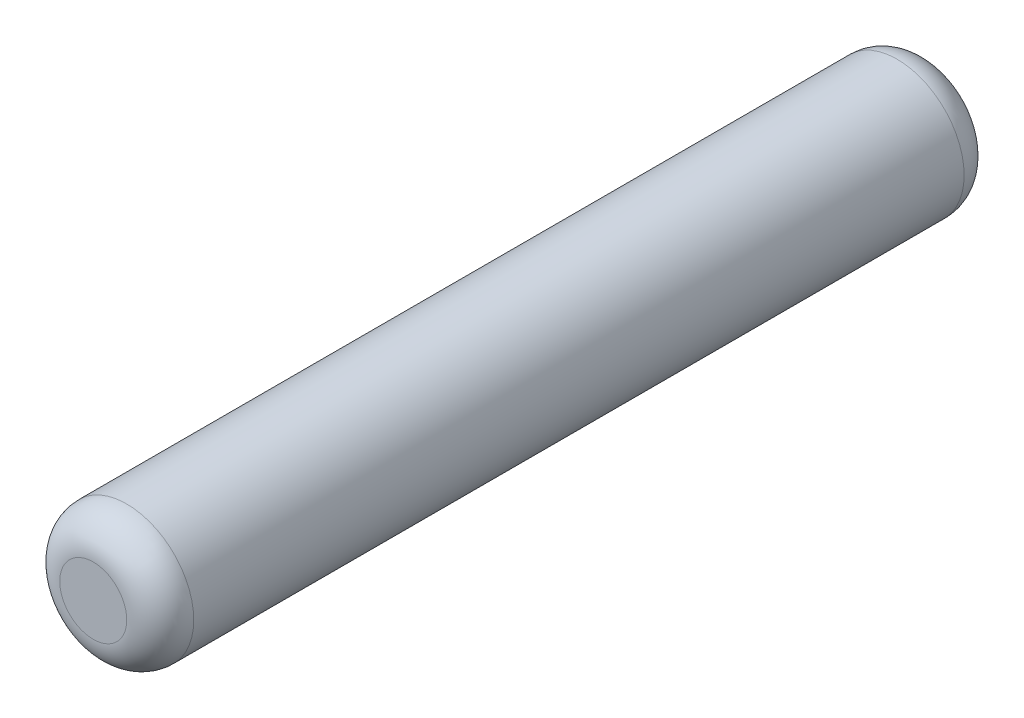
ISO-10303-21;
HEADER;
FILE_DESCRIPTION(('STEP AP214'),'2;1');
FILE_NAME('part.step','',(''),(''),'','','');
FILE_SCHEMA(('AUTOMOTIVE_DESIGN { 1 0 10303 214 1 1 1 1 }'));
ENDSEC;
DATA;
#1=APPLICATION_CONTEXT('core data for automotive mechanical design processes');
#2=APPLICATION_PROTOCOL_DEFINITION('international standard','automotive_design',2000,#1);
#3=PRODUCT_CONTEXT('',#1,'mechanical');
#4=PRODUCT('Part','Part','',(#3));
#5=PRODUCT_RELATED_PRODUCT_CATEGORY('part','',(#4));
#6=PRODUCT_DEFINITION_FORMATION('','',#4);
#7=PRODUCT_DEFINITION_CONTEXT('part definition',#1,'design');
#8=PRODUCT_DEFINITION('design','',#6,#7);
#9=PRODUCT_DEFINITION_SHAPE('','',#8);
#10=(LENGTH_UNIT() NAMED_UNIT(*) SI_UNIT(.MILLI.,.METRE.));
#11=(NAMED_UNIT(*) PLANE_ANGLE_UNIT() SI_UNIT($,.RADIAN.));
#12=(NAMED_UNIT(*) SI_UNIT($,.STERADIAN.) SOLID_ANGLE_UNIT());
#13=UNCERTAINTY_MEASURE_WITH_UNIT(LENGTH_MEASURE(1.E-05),#10,'distance_accuracy_value','');
#14=(GEOMETRIC_REPRESENTATION_CONTEXT(3) GLOBAL_UNCERTAINTY_ASSIGNED_CONTEXT((#13)) GLOBAL_UNIT_ASSIGNED_CONTEXT((#10,
#11,#12)) REPRESENTATION_CONTEXT('',''));
#15=CARTESIAN_POINT('',(0.,0.,0.));
#16=DIRECTION('',(0.,0.,1.));
#17=DIRECTION('',(1.,0.,0.));
#18=AXIS2_PLACEMENT_3D('',#15,#16,#17);
#19=CARTESIAN_POINT('',(0.,0.,250.));
#20=DIRECTION('',(0.,0.,-1.));
#21=DIRECTION('',(-1.,0.,0.));
#22=AXIS2_PLACEMENT_3D('',#19,#20,#21);
#23=CYLINDRICAL_SURFACE('',#22,20.);
#24=CARTESIAN_POINT('',(0.,0.,10.));
#25=DIRECTION('',(0.,0.,1.));
#26=DIRECTION('',(1.,0.,0.));
#27=AXIS2_PLACEMENT_3D('',#24,#25,#26);
#28=CIRCLE('',#27,20.);
#29=CARTESIAN_POINT('',(20.,0.,10.));
#30=VERTEX_POINT('',#29);
#31=EDGE_CURVE('E42',#30,#30,#28,.T.);
#32=ORIENTED_EDGE('',*,*,#31,.T.);
#33=EDGE_LOOP('',(#32));
#34=FACE_BOUND('',#33,.T.);
#35=CARTESIAN_POINT('',(0.,0.,240.));
#36=DIRECTION('',(0.,0.,1.));
#37=DIRECTION('',(1.,0.,0.));
#38=AXIS2_PLACEMENT_3D('',#35,#36,#37);
#39=CIRCLE('',#38,20.);
#40=CARTESIAN_POINT('',(20.,0.,240.));
#41=VERTEX_POINT('',#40);
#42=EDGE_CURVE('E46',#41,#41,#39,.F.);
#43=ORIENTED_EDGE('',*,*,#42,.T.);
#44=EDGE_LOOP('',(#43));
#45=FACE_BOUND('',#44,.T.);
#46=ADVANCED_FACE('F31',(#34,#45),#23,.T.);
#47=CARTESIAN_POINT('',(0.,0.,250.));
#48=DIRECTION('',(0.,0.,1.));
#49=DIRECTION('',(1.,0.,0.));
#50=AXIS2_PLACEMENT_3D('',#47,#48,#49);
#51=PLANE('',#50);
#52=CARTESIAN_POINT('',(0.,0.,250.));
#53=DIRECTION('',(0.,0.,1.));
#54=DIRECTION('',(1.,0.,0.));
#55=AXIS2_PLACEMENT_3D('',#52,#53,#54);
#56=CIRCLE('',#55,10.);
#57=CARTESIAN_POINT('',(10.,0.,250.));
#58=VERTEX_POINT('',#57);
#59=EDGE_CURVE('E10',#58,#58,#56,.T.);
#60=ORIENTED_EDGE('',*,*,#59,.T.);
#61=EDGE_LOOP('',(#60));
#62=FACE_BOUND('',#61,.T.);
#63=ADVANCED_FACE('F62',(#62),#51,.T.);
#64=CARTESIAN_POINT('',(0.,0.,0.));
#65=DIRECTION('',(0.,0.,1.));
#66=DIRECTION('',(1.,0.,0.));
#67=AXIS2_PLACEMENT_3D('',#64,#65,#66);
#68=PLANE('',#67);
#69=CARTESIAN_POINT('',(0.,0.,0.));
#70=DIRECTION('',(0.,0.,1.));
#71=DIRECTION('',(1.,0.,0.));
#72=AXIS2_PLACEMENT_3D('',#69,#70,#71);
#73=CIRCLE('',#72,10.);
#74=CARTESIAN_POINT('',(10.,0.,0.));
#75=VERTEX_POINT('',#74);
#76=EDGE_CURVE('E38',#75,#75,#73,.F.);
#77=ORIENTED_EDGE('',*,*,#76,.T.);
#78=EDGE_LOOP('',(#77));
#79=FACE_BOUND('',#78,.T.);
#80=ADVANCED_FACE('F59',(#79),#68,.F.);
#81=CARTESIAN_POINT('',(0.,0.,10.));
#82=DIRECTION('',(0.,0.,1.));
#83=DIRECTION('',(1.,0.,0.));
#84=AXIS2_PLACEMENT_3D('',#81,#82,#83);
#85=DEGENERATE_TOROIDAL_SURFACE('',#84,10.,10.,.T.);
#86=ORIENTED_EDGE('',*,*,#76,.F.);
#87=EDGE_LOOP('',(#86));
#88=FACE_BOUND('',#87,.T.);
#89=ORIENTED_EDGE('',*,*,#31,.F.);
#90=EDGE_LOOP('',(#89));
#91=FACE_BOUND('',#90,.T.);
#92=ADVANCED_FACE('F55',(#88,#91),#85,.T.);
#93=CARTESIAN_POINT('',(0.,0.,240.));
#94=DIRECTION('',(0.,0.,1.));
#95=DIRECTION('',(1.,0.,0.));
#96=AXIS2_PLACEMENT_3D('',#93,#94,#95);
#97=DEGENERATE_TOROIDAL_SURFACE('',#96,10.,10.,.T.);
#98=ORIENTED_EDGE('',*,*,#42,.F.);
#99=EDGE_LOOP('',(#98));
#100=FACE_BOUND('',#99,.T.);
#101=ORIENTED_EDGE('',*,*,#59,.F.);
#102=EDGE_LOOP('',(#101));
#103=FACE_BOUND('',#102,.T.);
#104=ADVANCED_FACE('F33',(#100,#103),#97,.T.);
#105=CLOSED_SHELL('',(#46,#63,#80,#92,#104));
#106=MANIFOLD_SOLID_BREP('B2',#105);
#107=ADVANCED_BREP_SHAPE_REPRESENTATION('',(#18,#106),#14);
#108=SHAPE_DEFINITION_REPRESENTATION(#9,#107);
ENDSEC;
END-ISO-10303-21;
